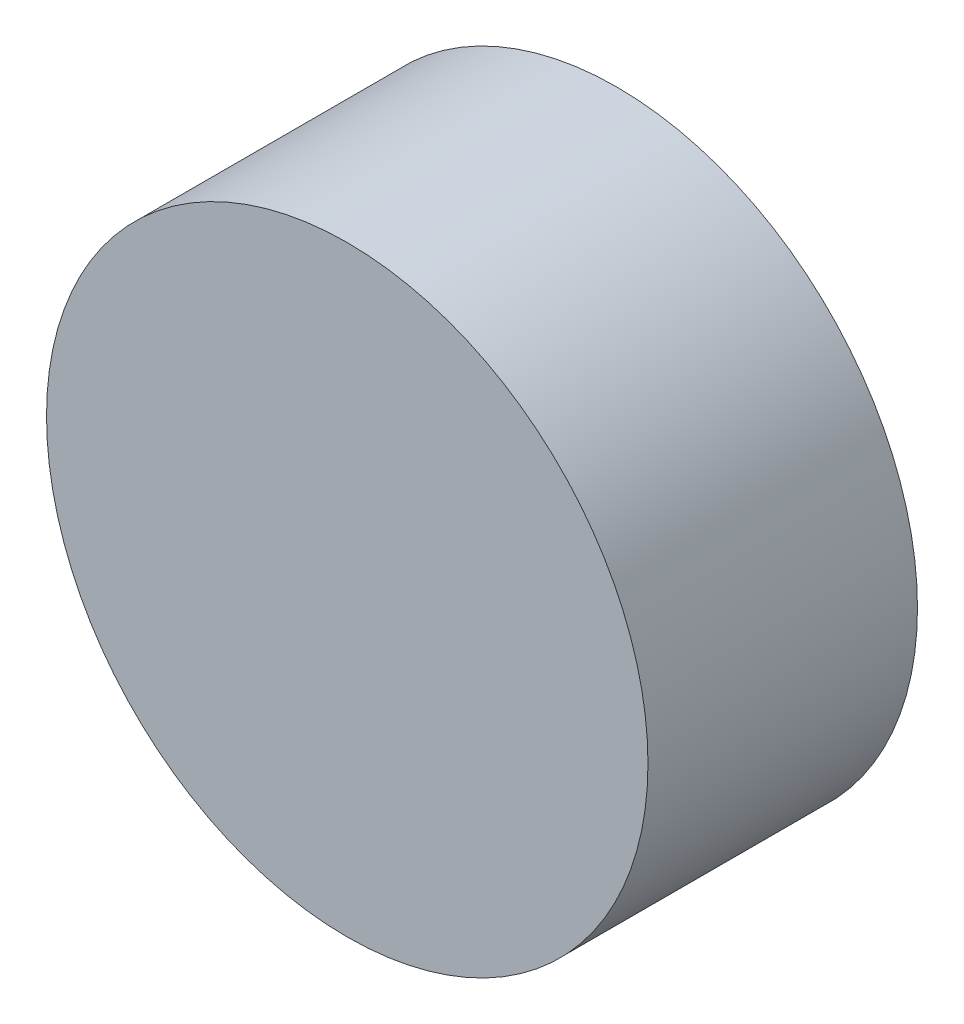
ISO-10303-21;
HEADER;
FILE_DESCRIPTION(('STEP AP214'),'2;1');
FILE_NAME('part.step','',(''),(''),'','','');
FILE_SCHEMA(('AUTOMOTIVE_DESIGN { 1 0 10303 214 1 1 1 1 }'));
ENDSEC;
DATA;
#1=APPLICATION_CONTEXT('core data for automotive mechanical design processes');
#2=APPLICATION_PROTOCOL_DEFINITION('international standard','automotive_design',2000,#1);
#3=PRODUCT_CONTEXT('',#1,'mechanical');
#4=PRODUCT('Part','Part','',(#3));
#5=PRODUCT_RELATED_PRODUCT_CATEGORY('part','',(#4));
#6=PRODUCT_DEFINITION_FORMATION('','',#4);
#7=PRODUCT_DEFINITION_CONTEXT('part definition',#1,'design');
#8=PRODUCT_DEFINITION('design','',#6,#7);
#9=PRODUCT_DEFINITION_SHAPE('','',#8);
#10=(LENGTH_UNIT() NAMED_UNIT(*) SI_UNIT(.MILLI.,.METRE.));
#11=(NAMED_UNIT(*) PLANE_ANGLE_UNIT() SI_UNIT($,.RADIAN.));
#12=(NAMED_UNIT(*) SI_UNIT($,.STERADIAN.) SOLID_ANGLE_UNIT());
#13=UNCERTAINTY_MEASURE_WITH_UNIT(LENGTH_MEASURE(1.E-05),#10,'distance_accuracy_value','');
#14=(GEOMETRIC_REPRESENTATION_CONTEXT(3) GLOBAL_UNCERTAINTY_ASSIGNED_CONTEXT((#13)) GLOBAL_UNIT_ASSIGNED_CONTEXT((#10,
#11,#12)) REPRESENTATION_CONTEXT('',''));
#15=CARTESIAN_POINT('',(0.,0.,0.));
#16=DIRECTION('',(0.,0.,1.));
#17=DIRECTION('',(1.,0.,0.));
#18=AXIS2_PLACEMENT_3D('',#15,#16,#17);
#19=CARTESIAN_POINT('',(0.0144461559695048,-8.86325816433722,-4.75584858589366));
#20=DIRECTION('',(0.,0.,-1.));
#21=DIRECTION('',(-1.,0.,0.));
#22=AXIS2_PLACEMENT_3D('',#19,#20,#21);
#23=PLANE('',#22);
#24=CARTESIAN_POINT('',(0.0144461559695048,-6.68948341433636,-4.75584858589366));
#25=DIRECTION('',(0.,0.,-1.));
#26=DIRECTION('',(-1.,0.,0.));
#27=AXIS2_PLACEMENT_3D('',#24,#25,#26);
#28=CIRCLE('',#27,0.836887374999906);
#29=CARTESIAN_POINT('',(-0.822441219030401,-6.68948341433636,-4.75584858589366));
#30=VERTEX_POINT('',#29);
#31=EDGE_CURVE('E20',#30,#30,#28,.F.);
#32=ORIENTED_EDGE('',*,*,#31,.F.);
#33=EDGE_LOOP('',(#32));
#34=FACE_BOUND('',#33,.T.);
#35=ADVANCED_FACE('F17',(#34),#23,.T.);
#36=CARTESIAN_POINT('',(0.0144461559695048,-6.68948341433636,-4.75584858589366));
#37=DIRECTION('',(0.,0.,-1.));
#38=DIRECTION('',(-1.,0.,0.));
#39=AXIS2_PLACEMENT_3D('',#36,#37,#38);
#40=CYLINDRICAL_SURFACE('',#39,0.836887374999906);
#41=ORIENTED_EDGE('',*,*,#31,.T.);
#42=EDGE_LOOP('',(#41));
#43=FACE_BOUND('',#42,.T.);
#44=CARTESIAN_POINT('',(0.0144461559695048,-6.68948341433636,-4.00584858589412));
#45=DIRECTION('',(0.,0.,-1.));
#46=DIRECTION('',(-1.,0.,0.));
#47=AXIS2_PLACEMENT_3D('',#44,#45,#46);
#48=CIRCLE('',#47,0.836887374999906);
#49=CARTESIAN_POINT('',(-0.822441219030401,-6.68948341433636,-4.00584858589412));
#50=VERTEX_POINT('',#49);
#51=EDGE_CURVE('E10',#50,#50,#48,.F.);
#52=ORIENTED_EDGE('',*,*,#51,.F.);
#53=EDGE_LOOP('',(#52));
#54=FACE_BOUND('',#53,.T.);
#55=ADVANCED_FACE('F29',(#43,#54),#40,.T.);
#56=CARTESIAN_POINT('',(0.0144461559695048,-6.68948341433636,-4.00584858589412));
#57=DIRECTION('',(0.,0.,1.));
#58=DIRECTION('',(1.,0.,0.));
#59=AXIS2_PLACEMENT_3D('',#56,#57,#58);
#60=PLANE('',#59);
#61=ORIENTED_EDGE('',*,*,#51,.T.);
#62=EDGE_LOOP('',(#61));
#63=FACE_BOUND('',#62,.T.);
#64=ADVANCED_FACE('F37',(#63),#60,.T.);
#65=CLOSED_SHELL('',(#35,#55,#64));
#66=MANIFOLD_SOLID_BREP('B1',#65);
#67=ADVANCED_BREP_SHAPE_REPRESENTATION('',(#18,#66),#14);
#68=SHAPE_DEFINITION_REPRESENTATION(#9,#67);
ENDSEC;
END-ISO-10303-21;
